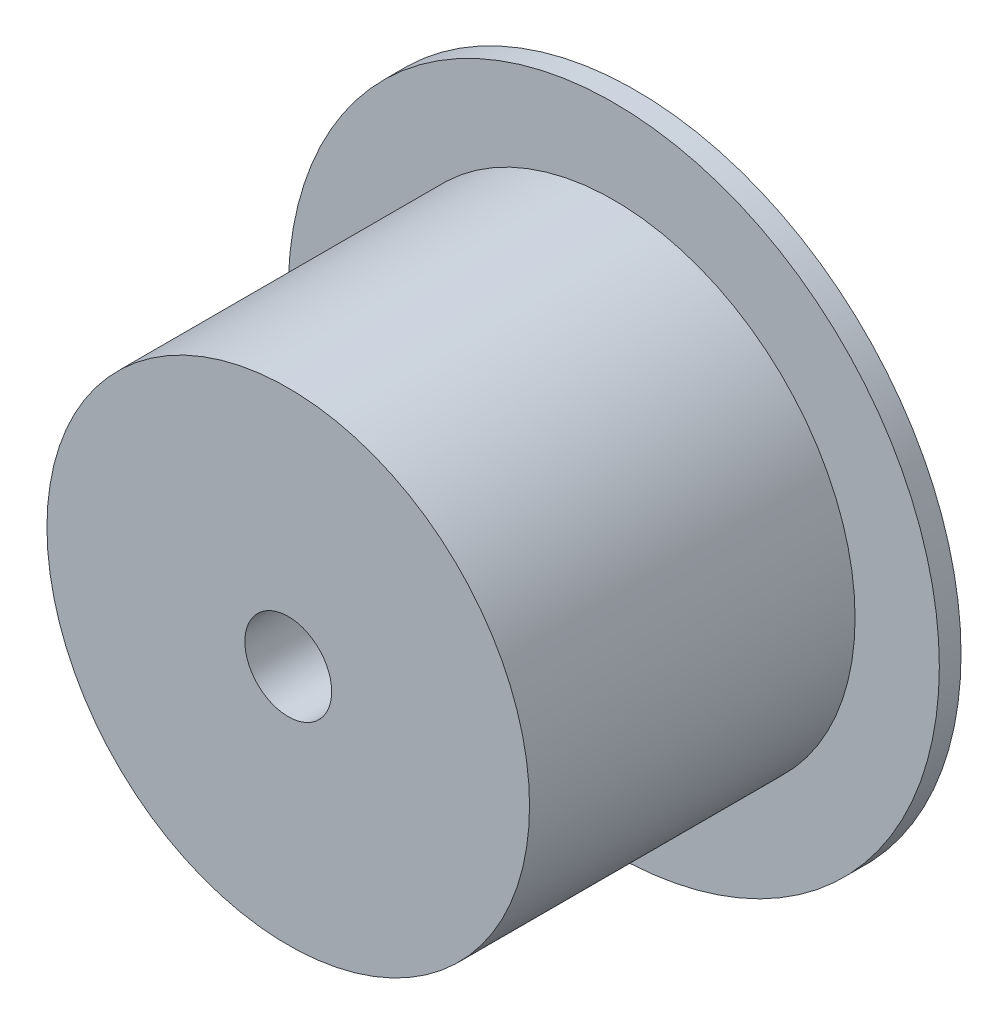
ISO-10303-21;
HEADER;
FILE_DESCRIPTION(('STEP AP214'),'2;1');
FILE_NAME('part.step','',(''),(''),'','','');
FILE_SCHEMA(('AUTOMOTIVE_DESIGN { 1 0 10303 214 1 1 1 1 }'));
ENDSEC;
DATA;
#1=APPLICATION_CONTEXT('core data for automotive mechanical design processes');
#2=APPLICATION_PROTOCOL_DEFINITION('international standard','automotive_design',2000,#1);
#3=PRODUCT_CONTEXT('',#1,'mechanical');
#4=PRODUCT('Part','Part','',(#3));
#5=PRODUCT_RELATED_PRODUCT_CATEGORY('part','',(#4));
#6=PRODUCT_DEFINITION_FORMATION('','',#4);
#7=PRODUCT_DEFINITION_CONTEXT('part definition',#1,'design');
#8=PRODUCT_DEFINITION('design','',#6,#7);
#9=PRODUCT_DEFINITION_SHAPE('','',#8);
#10=(LENGTH_UNIT() NAMED_UNIT(*) SI_UNIT(.MILLI.,.METRE.));
#11=(NAMED_UNIT(*) PLANE_ANGLE_UNIT() SI_UNIT($,.RADIAN.));
#12=(NAMED_UNIT(*) SI_UNIT($,.STERADIAN.) SOLID_ANGLE_UNIT());
#13=UNCERTAINTY_MEASURE_WITH_UNIT(LENGTH_MEASURE(1.E-05),#10,'distance_accuracy_value','');
#14=(GEOMETRIC_REPRESENTATION_CONTEXT(3) GLOBAL_UNCERTAINTY_ASSIGNED_CONTEXT((#13)) GLOBAL_UNIT_ASSIGNED_CONTEXT((#10,
#11,#12)) REPRESENTATION_CONTEXT('',''));
#15=CARTESIAN_POINT('',(0.,0.,0.));
#16=DIRECTION('',(0.,0.,1.));
#17=DIRECTION('',(1.,0.,0.));
#18=AXIS2_PLACEMENT_3D('',#15,#16,#17);
#19=CARTESIAN_POINT('',(-15.799728609314,0.,1.));
#20=DIRECTION('',(0.,0.,1.));
#21=DIRECTION('',(1.,0.,0.));
#22=AXIS2_PLACEMENT_3D('',#19,#20,#21);
#23=PLANE('',#22);
#24=CARTESIAN_POINT('',(-15.799728609314,0.,1.));
#25=DIRECTION('',(0.,0.,1.));
#26=DIRECTION('',(1.,0.,0.));
#27=AXIS2_PLACEMENT_3D('',#24,#25,#26);
#28=CIRCLE('',#27,15.);
#29=CARTESIAN_POINT('',(-0.799728609313974,0.,1.));
#30=VERTEX_POINT('',#29);
#31=EDGE_CURVE('E10',#30,#30,#28,.T.);
#32=ORIENTED_EDGE('',*,*,#31,.T.);
#33=EDGE_LOOP('',(#32));
#34=FACE_BOUND('',#33,.T.);
#35=CARTESIAN_POINT('',(-15.799728609314,0.,1.));
#36=DIRECTION('',(0.,0.,1.));
#37=DIRECTION('',(1.,0.,0.));
#38=AXIS2_PLACEMENT_3D('',#35,#36,#37);
#39=CIRCLE('',#38,11.1180134592339);
#40=CARTESIAN_POINT('',(-4.68171515008008,0.,1.));
#41=VERTEX_POINT('',#40);
#42=EDGE_CURVE('E50',#41,#41,#39,.T.);
#43=ORIENTED_EDGE('',*,*,#42,.F.);
#44=EDGE_LOOP('',(#43));
#45=FACE_BOUND('',#44,.T.);
#46=ADVANCED_FACE('F34',(#34,#45),#23,.T.);
#47=CARTESIAN_POINT('',(-15.799728609314,0.,1.));
#48=DIRECTION('',(0.,0.,-1.));
#49=DIRECTION('',(-1.,0.,0.));
#50=AXIS2_PLACEMENT_3D('',#47,#48,#49);
#51=CYLINDRICAL_SURFACE('',#50,15.);
#52=ORIENTED_EDGE('',*,*,#31,.F.);
#53=EDGE_LOOP('',(#52));
#54=FACE_BOUND('',#53,.T.);
#55=CARTESIAN_POINT('',(-15.799728609314,0.,0.));
#56=DIRECTION('',(0.,0.,1.));
#57=DIRECTION('',(1.,0.,0.));
#58=AXIS2_PLACEMENT_3D('',#55,#56,#57);
#59=CIRCLE('',#58,15.);
#60=CARTESIAN_POINT('',(-0.799728609313974,0.,0.));
#61=VERTEX_POINT('',#60);
#62=EDGE_CURVE('E38',#61,#61,#59,.T.);
#63=ORIENTED_EDGE('',*,*,#62,.T.);
#64=EDGE_LOOP('',(#63));
#65=FACE_BOUND('',#64,.T.);
#66=ADVANCED_FACE('F36',(#54,#65),#51,.T.);
#67=CARTESIAN_POINT('',(-15.799728609314,0.,0.));
#68=DIRECTION('',(0.,0.,1.));
#69=DIRECTION('',(1.,0.,0.));
#70=AXIS2_PLACEMENT_3D('',#67,#68,#69);
#71=PLANE('',#70);
#72=CARTESIAN_POINT('',(-15.799728609314,0.,0.));
#73=DIRECTION('',(0.,0.,1.));
#74=DIRECTION('',(1.,0.,0.));
#75=AXIS2_PLACEMENT_3D('',#72,#73,#74);
#76=CIRCLE('',#75,2.);
#77=CARTESIAN_POINT('',(-13.799728609314,0.,0.));
#78=VERTEX_POINT('',#77);
#79=EDGE_CURVE('E54',#78,#78,#76,.T.);
#80=ORIENTED_EDGE('',*,*,#79,.T.);
#81=EDGE_LOOP('',(#80));
#82=FACE_BOUND('',#81,.T.);
#83=ORIENTED_EDGE('',*,*,#62,.F.);
#84=EDGE_LOOP('',(#83));
#85=FACE_BOUND('',#84,.T.);
#86=ADVANCED_FACE('F65',(#82,#85),#71,.F.);
#87=CARTESIAN_POINT('',(-15.799728609314,0.,16.));
#88=DIRECTION('',(0.,0.,-1.));
#89=DIRECTION('',(-1.,0.,0.));
#90=AXIS2_PLACEMENT_3D('',#87,#88,#89);
#91=CYLINDRICAL_SURFACE('',#90,11.1180134592339);
#92=CARTESIAN_POINT('',(-15.799728609314,0.,16.));
#93=DIRECTION('',(0.,0.,1.));
#94=DIRECTION('',(1.,0.,0.));
#95=AXIS2_PLACEMENT_3D('',#92,#93,#94);
#96=CIRCLE('',#95,11.1180134592339);
#97=CARTESIAN_POINT('',(-4.68171515008008,0.,16.));
#98=VERTEX_POINT('',#97);
#99=EDGE_CURVE('E48',#98,#98,#96,.T.);
#100=ORIENTED_EDGE('',*,*,#99,.F.);
#101=EDGE_LOOP('',(#100));
#102=FACE_BOUND('',#101,.T.);
#103=ORIENTED_EDGE('',*,*,#42,.T.);
#104=EDGE_LOOP('',(#103));
#105=FACE_BOUND('',#104,.T.);
#106=ADVANCED_FACE('F77',(#102,#105),#91,.T.);
#107=CARTESIAN_POINT('',(-15.799728609314,0.,16.));
#108=DIRECTION('',(0.,0.,1.));
#109=DIRECTION('',(1.,0.,0.));
#110=AXIS2_PLACEMENT_3D('',#107,#108,#109);
#111=PLANE('',#110);
#112=CARTESIAN_POINT('',(-15.799728609314,0.,16.));
#113=DIRECTION('',(0.,0.,1.));
#114=DIRECTION('',(1.,0.,0.));
#115=AXIS2_PLACEMENT_3D('',#112,#113,#114);
#116=CIRCLE('',#115,2.);
#117=CARTESIAN_POINT('',(-13.799728609314,0.,16.));
#118=VERTEX_POINT('',#117);
#119=EDGE_CURVE('E58',#118,#118,#116,.T.);
#120=ORIENTED_EDGE('',*,*,#119,.F.);
#121=EDGE_LOOP('',(#120));
#122=FACE_BOUND('',#121,.T.);
#123=ORIENTED_EDGE('',*,*,#99,.T.);
#124=EDGE_LOOP('',(#123));
#125=FACE_BOUND('',#124,.T.);
#126=ADVANCED_FACE('F71',(#122,#125),#111,.T.);
#127=CARTESIAN_POINT('',(-15.799728609314,0.,0.));
#128=DIRECTION('',(0.,0.,1.));
#129=DIRECTION('',(1.,0.,0.));
#130=AXIS2_PLACEMENT_3D('',#127,#128,#129);
#131=CYLINDRICAL_SURFACE('',#130,2.);
#132=ORIENTED_EDGE('',*,*,#79,.F.);
#133=EDGE_LOOP('',(#132));
#134=FACE_BOUND('',#133,.T.);
#135=ORIENTED_EDGE('',*,*,#119,.T.);
#136=EDGE_LOOP('',(#135));
#137=FACE_BOUND('',#136,.T.);
#138=ADVANCED_FACE('F68',(#134,#137),#131,.F.);
#139=CLOSED_SHELL('',(#46,#66,#86,#106,#126,#138));
#140=MANIFOLD_SOLID_BREP('B2',#139);
#141=ADVANCED_BREP_SHAPE_REPRESENTATION('',(#18,#140),#14);
#142=SHAPE_DEFINITION_REPRESENTATION(#9,#141);
ENDSEC;
END-ISO-10303-21;
